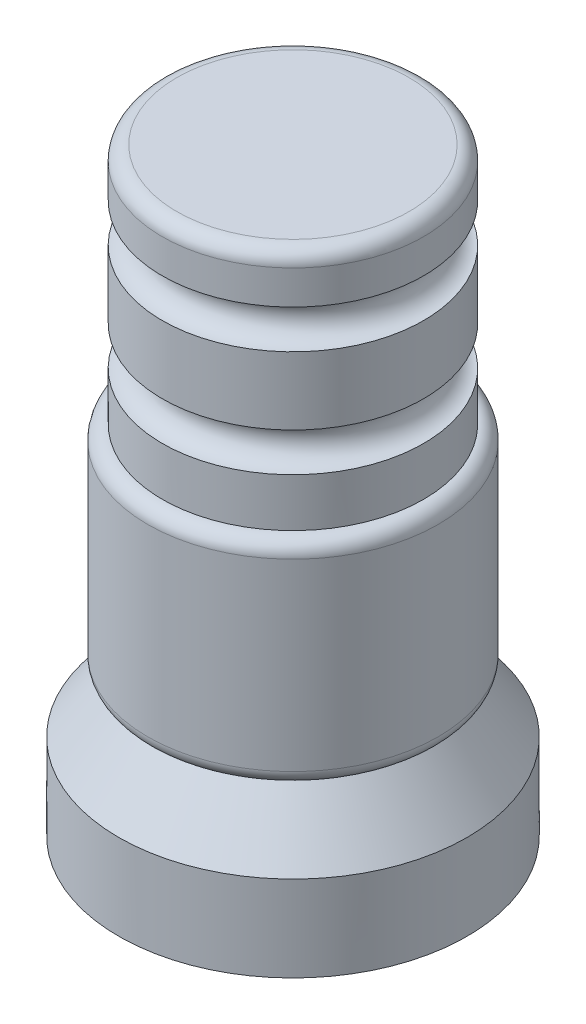
ISO-10303-21;
HEADER;
FILE_DESCRIPTION(('STEP AP214'),'2;1');
FILE_NAME('part.step','',(''),(''),'','','');
FILE_SCHEMA(('AUTOMOTIVE_DESIGN { 1 0 10303 214 1 1 1 1 }'));
ENDSEC;
DATA;
#1=APPLICATION_CONTEXT('core data for automotive mechanical design processes');
#2=APPLICATION_PROTOCOL_DEFINITION('international standard','automotive_design',2000,#1);
#3=PRODUCT_CONTEXT('',#1,'mechanical');
#4=PRODUCT('Part','Part','',(#3));
#5=PRODUCT_RELATED_PRODUCT_CATEGORY('part','',(#4));
#6=PRODUCT_DEFINITION_FORMATION('','',#4);
#7=PRODUCT_DEFINITION_CONTEXT('part definition',#1,'design');
#8=PRODUCT_DEFINITION('design','',#6,#7);
#9=PRODUCT_DEFINITION_SHAPE('','',#8);
#10=(LENGTH_UNIT() NAMED_UNIT(*) SI_UNIT(.MILLI.,.METRE.));
#11=(NAMED_UNIT(*) PLANE_ANGLE_UNIT() SI_UNIT($,.RADIAN.));
#12=(NAMED_UNIT(*) SI_UNIT($,.STERADIAN.) SOLID_ANGLE_UNIT());
#13=UNCERTAINTY_MEASURE_WITH_UNIT(LENGTH_MEASURE(1.E-05),#10,'distance_accuracy_value','');
#14=(GEOMETRIC_REPRESENTATION_CONTEXT(3) GLOBAL_UNCERTAINTY_ASSIGNED_CONTEXT((#13)) GLOBAL_UNIT_ASSIGNED_CONTEXT((#10,
#11,#12)) REPRESENTATION_CONTEXT('',''));
#15=CARTESIAN_POINT('',(0.,0.,0.));
#16=DIRECTION('',(0.,0.,1.));
#17=DIRECTION('',(1.,0.,0.));
#18=AXIS2_PLACEMENT_3D('',#15,#16,#17);
#19=CARTESIAN_POINT('',(-11.0661066677932,-10.1124479600333,0.));
#20=DIRECTION('',(0.,1.,0.));
#21=DIRECTION('',(-1.,0.,0.));
#22=AXIS2_PLACEMENT_3D('',#19,#20,#21);
#23=CYLINDRICAL_SURFACE('',#22,15.);
#24=CARTESIAN_POINT('',(-11.0661066677932,10.3875520399667,0.));
#25=DIRECTION('',(0.,-1.,0.));
#26=DIRECTION('',(1.,0.,0.));
#27=AXIS2_PLACEMENT_3D('',#24,#25,#26);
#28=CIRCLE('',#27,15.);
#29=CARTESIAN_POINT('',(3.93389333220679,10.3875520399667,0.));
#30=VERTEX_POINT('',#29);
#31=EDGE_CURVE('E44',#30,#30,#28,.T.);
#32=ORIENTED_EDGE('',*,*,#31,.T.);
#33=EDGE_LOOP('',(#32));
#34=FACE_BOUND('',#33,.T.);
#35=CARTESIAN_POINT('',(-11.0661066677932,-8.6124479600333,0.));
#36=DIRECTION('',(0.,-1.,0.));
#37=DIRECTION('',(1.,0.,0.));
#38=AXIS2_PLACEMENT_3D('',#35,#36,#37);
#39=CIRCLE('',#38,15.);
#40=CARTESIAN_POINT('',(3.93389333220679,-8.61244796003331,0.));
#41=VERTEX_POINT('',#40);
#42=EDGE_CURVE('E48',#41,#41,#39,.F.);
#43=ORIENTED_EDGE('',*,*,#42,.T.);
#44=EDGE_LOOP('',(#43));
#45=FACE_BOUND('',#44,.T.);
#46=ADVANCED_FACE('F37',(#34,#45),#23,.T.);
#47=CARTESIAN_POINT('',(-11.0661066677932,36.8875520399667,0.));
#48=DIRECTION('',(0.,1.,0.));
#49=DIRECTION('',(-1.,0.,0.));
#50=AXIS2_PLACEMENT_3D('',#47,#48,#49);
#51=CYLINDRICAL_SURFACE('',#50,13.5);
#52=CARTESIAN_POINT('',(-11.0661066677932,11.8875520399667,0.));
#53=DIRECTION('',(0.,-1.,0.));
#54=DIRECTION('',(1.,0.,0.));
#55=AXIS2_PLACEMENT_3D('',#52,#53,#54);
#56=CIRCLE('',#55,13.5);
#57=CARTESIAN_POINT('',(2.43389333220679,11.8875520399667,0.));
#58=VERTEX_POINT('',#57);
#59=EDGE_CURVE('E72',#58,#58,#56,.F.);
#60=ORIENTED_EDGE('',*,*,#59,.T.);
#61=EDGE_LOOP('',(#60));
#62=FACE_BOUND('',#61,.T.);
#63=CARTESIAN_POINT('',(-11.0661066677932,16.8875520399667,0.));
#64=DIRECTION('',(0.,1.,0.));
#65=DIRECTION('',(-1.,0.,0.));
#66=AXIS2_PLACEMENT_3D('',#63,#64,#65);
#67=CIRCLE('',#66,13.5);
#68=CARTESIAN_POINT('',(-24.5661066677932,16.8875520399667,0.));
#69=VERTEX_POINT('',#68);
#70=EDGE_CURVE('E57',#69,#69,#67,.T.);
#71=ORIENTED_EDGE('',*,*,#70,.F.);
#72=EDGE_LOOP('',(#71));
#73=FACE_BOUND('',#72,.T.);
#74=ADVANCED_FACE('F94',(#62,#73),#51,.T.);
#75=CARTESIAN_POINT('',(-11.0661066677932,18.8875520399667,0.));
#76=DIRECTION('',(0.,1.,0.));
#77=DIRECTION('',(-1.,0.,0.));
#78=AXIS2_PLACEMENT_3D('',#75,#76,#77);
#79=TOROIDAL_SURFACE('',#78,13.5,2.);
#80=ORIENTED_EDGE('',*,*,#70,.T.);
#81=EDGE_LOOP('',(#80));
#82=FACE_BOUND('',#81,.T.);
#83=CARTESIAN_POINT('',(-11.0661066677932,20.8875520399667,0.));
#84=DIRECTION('',(0.,1.,0.));
#85=DIRECTION('',(-1.,0.,0.));
#86=AXIS2_PLACEMENT_3D('',#83,#84,#85);
#87=CIRCLE('',#86,13.5);
#88=CARTESIAN_POINT('',(-24.5661066677932,20.8875520399667,0.));
#89=VERTEX_POINT('',#88);
#90=EDGE_CURVE('E60',#89,#89,#87,.T.);
#91=ORIENTED_EDGE('',*,*,#90,.F.);
#92=EDGE_LOOP('',(#91));
#93=FACE_BOUND('',#92,.T.);
#94=ADVANCED_FACE('F99',(#82,#93),#79,.F.);
#95=CARTESIAN_POINT('',(-11.0661066677932,36.8875520399667,0.));
#96=DIRECTION('',(0.,1.,0.));
#97=DIRECTION('',(-1.,0.,0.));
#98=AXIS2_PLACEMENT_3D('',#95,#96,#97);
#99=CYLINDRICAL_SURFACE('',#98,13.5);
#100=ORIENTED_EDGE('',*,*,#90,.T.);
#101=EDGE_LOOP('',(#100));
#102=FACE_BOUND('',#101,.T.);
#103=CARTESIAN_POINT('',(-11.0661066677932,27.8875520399667,0.));
#104=DIRECTION('',(0.,1.,0.));
#105=DIRECTION('',(-1.,0.,0.));
#106=AXIS2_PLACEMENT_3D('',#103,#104,#105);
#107=CIRCLE('',#106,13.5);
#108=CARTESIAN_POINT('',(-24.5661066677932,27.8875520399667,0.));
#109=VERTEX_POINT('',#108);
#110=EDGE_CURVE('E63',#109,#109,#107,.T.);
#111=ORIENTED_EDGE('',*,*,#110,.F.);
#112=EDGE_LOOP('',(#111));
#113=FACE_BOUND('',#112,.T.);
#114=ADVANCED_FACE('F118',(#102,#113),#99,.T.);
#115=CARTESIAN_POINT('',(-11.0661066677932,29.8875520399667,0.));
#116=DIRECTION('',(0.,1.,0.));
#117=DIRECTION('',(-1.,0.,0.));
#118=AXIS2_PLACEMENT_3D('',#115,#116,#117);
#119=TOROIDAL_SURFACE('',#118,13.5,2.);
#120=ORIENTED_EDGE('',*,*,#110,.T.);
#121=EDGE_LOOP('',(#120));
#122=FACE_BOUND('',#121,.T.);
#123=CARTESIAN_POINT('',(-11.0661066677932,31.8875520399667,0.));
#124=DIRECTION('',(0.,1.,0.));
#125=DIRECTION('',(-1.,0.,0.));
#126=AXIS2_PLACEMENT_3D('',#123,#124,#125);
#127=CIRCLE('',#126,13.5);
#128=CARTESIAN_POINT('',(-24.5661066677932,31.8875520399667,0.));
#129=VERTEX_POINT('',#128);
#130=EDGE_CURVE('E66',#129,#129,#127,.T.);
#131=ORIENTED_EDGE('',*,*,#130,.F.);
#132=EDGE_LOOP('',(#131));
#133=FACE_BOUND('',#132,.T.);
#134=ADVANCED_FACE('F114',(#122,#133),#119,.F.);
#135=CARTESIAN_POINT('',(-11.0661066677932,36.8875520399667,0.));
#136=DIRECTION('',(0.,1.,0.));
#137=DIRECTION('',(-1.,0.,0.));
#138=AXIS2_PLACEMENT_3D('',#135,#136,#137);
#139=CYLINDRICAL_SURFACE('',#138,13.5);
#140=CARTESIAN_POINT('',(-11.0661066677932,35.3875520399667,0.));
#141=DIRECTION('',(0.,1.,0.));
#142=DIRECTION('',(-1.,0.,0.));
#143=AXIS2_PLACEMENT_3D('',#140,#141,#142);
#144=CIRCLE('',#143,13.5);
#145=CARTESIAN_POINT('',(-24.5661066677932,35.3875520399667,0.));
#146=VERTEX_POINT('',#145);
#147=EDGE_CURVE('E52',#146,#146,#144,.F.);
#148=ORIENTED_EDGE('',*,*,#147,.T.);
#149=EDGE_LOOP('',(#148));
#150=FACE_BOUND('',#149,.T.);
#151=ORIENTED_EDGE('',*,*,#130,.T.);
#152=EDGE_LOOP('',(#151));
#153=FACE_BOUND('',#152,.T.);
#154=ADVANCED_FACE('F111',(#150,#153),#139,.T.);
#155=CARTESIAN_POINT('',(-11.0661066677932,35.3875520399667,0.));
#156=DIRECTION('',(0.,1.,0.));
#157=DIRECTION('',(-1.,0.,0.));
#158=AXIS2_PLACEMENT_3D('',#155,#156,#157);
#159=TOROIDAL_SURFACE('',#158,12.,1.5);
#160=ORIENTED_EDGE('',*,*,#147,.F.);
#161=EDGE_LOOP('',(#160));
#162=FACE_BOUND('',#161,.T.);
#163=CARTESIAN_POINT('',(-11.0661066677932,36.8875520399667,0.));
#164=DIRECTION('',(0.,1.,0.));
#165=DIRECTION('',(-1.,0.,0.));
#166=AXIS2_PLACEMENT_3D('',#163,#164,#165);
#167=CIRCLE('',#166,12.);
#168=CARTESIAN_POINT('',(-23.0661066677932,36.8875520399667,0.));
#169=VERTEX_POINT('',#168);
#170=EDGE_CURVE('E69',#169,#169,#167,.F.);
#171=ORIENTED_EDGE('',*,*,#170,.T.);
#172=EDGE_LOOP('',(#171));
#173=FACE_BOUND('',#172,.T.);
#174=ADVANCED_FACE('F109',(#162,#173),#159,.T.);
#175=CARTESIAN_POINT('',(-11.0661066677932,36.8875520399667,0.));
#176=DIRECTION('',(0.,1.,0.));
#177=DIRECTION('',(-1.,0.,0.));
#178=AXIS2_PLACEMENT_3D('',#175,#176,#177);
#179=PLANE('',#178);
#180=ORIENTED_EDGE('',*,*,#170,.F.);
#181=EDGE_LOOP('',(#180));
#182=FACE_BOUND('',#181,.T.);
#183=ADVANCED_FACE('F105',(#182),#179,.T.);
#184=CARTESIAN_POINT('',(-11.0661066677932,10.3875520399667,0.));
#185=DIRECTION('',(0.,-1.,0.));
#186=DIRECTION('',(1.,0.,0.));
#187=AXIS2_PLACEMENT_3D('',#184,#185,#186);
#188=TOROIDAL_SURFACE('',#187,13.5,1.5);
#189=ORIENTED_EDGE('',*,*,#59,.F.);
#190=EDGE_LOOP('',(#189));
#191=FACE_BOUND('',#190,.T.);
#192=ORIENTED_EDGE('',*,*,#31,.F.);
#193=EDGE_LOOP('',(#192));
#194=FACE_BOUND('',#193,.T.);
#195=ADVANCED_FACE('F108',(#191,#194),#188,.T.);
#196=CARTESIAN_POINT('',(-11.0661066677932,-8.6124479600333,0.));
#197=DIRECTION('',(0.,-1.,0.));
#198=DIRECTION('',(1.,0.,0.));
#199=AXIS2_PLACEMENT_3D('',#196,#197,#198);
#200=TOROIDAL_SURFACE('',#199,13.5,1.5);
#201=ORIENTED_EDGE('',*,*,#42,.F.);
#202=EDGE_LOOP('',(#201));
#203=FACE_BOUND('',#202,.T.);
#204=CARTESIAN_POINT('',(-11.0661066677932,-10.1124479600333,0.));
#205=DIRECTION('',(0.,-1.,0.));
#206=DIRECTION('',(1.,0.,0.));
#207=AXIS2_PLACEMENT_3D('',#204,#205,#206);
#208=CIRCLE('',#207,13.5);
#209=CARTESIAN_POINT('',(2.43389333220679,-10.1124479600333,0.));
#210=VERTEX_POINT('',#209);
#211=EDGE_CURVE('E10',#210,#210,#208,.T.);
#212=ORIENTED_EDGE('',*,*,#211,.F.);
#213=EDGE_LOOP('',(#212));
#214=FACE_BOUND('',#213,.T.);
#215=ADVANCED_FACE('F39',(#203,#214),#200,.T.);
#216=CARTESIAN_POINT('',(-11.0661066677932,-16.1124479600333,0.));
#217=DIRECTION('',(0.,-1.,0.));
#218=DIRECTION('',(1.,0.,0.));
#219=AXIS2_PLACEMENT_3D('',#216,#217,#218);
#220=CONICAL_SURFACE('',#219,18.,0.643501108793284);
#221=ORIENTED_EDGE('',*,*,#211,.T.);
#222=EDGE_LOOP('',(#221));
#223=FACE_BOUND('',#222,.T.);
#224=CARTESIAN_POINT('',(-11.0661066677932,-16.1124479600333,0.));
#225=DIRECTION('',(0.,1.,0.));
#226=DIRECTION('',(-1.,0.,0.));
#227=AXIS2_PLACEMENT_3D('',#224,#225,#226);
#228=CIRCLE('',#227,18.);
#229=CARTESIAN_POINT('',(-29.0661066677932,-16.1124479600333,0.));
#230=VERTEX_POINT('',#229);
#231=EDGE_CURVE('E75',#230,#230,#228,.T.);
#232=ORIENTED_EDGE('',*,*,#231,.T.);
#233=EDGE_LOOP('',(#232));
#234=FACE_BOUND('',#233,.T.);
#235=ADVANCED_FACE('F90',(#223,#234),#220,.T.);
#236=CARTESIAN_POINT('',(-11.0661066677932,-10.1124479600333,0.));
#237=DIRECTION('',(0.,1.,0.));
#238=DIRECTION('',(-1.,0.,0.));
#239=AXIS2_PLACEMENT_3D('',#236,#237,#238);
#240=CYLINDRICAL_SURFACE('',#239,18.);
#241=ORIENTED_EDGE('',*,*,#231,.F.);
#242=EDGE_LOOP('',(#241));
#243=FACE_BOUND('',#242,.T.);
#244=CARTESIAN_POINT('',(-11.0661066677932,-24.9622468404596,0.));
#245=DIRECTION('',(0.,1.,0.));
#246=DIRECTION('',(-1.,0.,0.));
#247=AXIS2_PLACEMENT_3D('',#244,#245,#246);
#248=CIRCLE('',#247,18.);
#249=CARTESIAN_POINT('',(-29.0661066677932,-24.9622468404596,0.));
#250=VERTEX_POINT('',#249);
#251=EDGE_CURVE('E78',#250,#250,#248,.T.);
#252=ORIENTED_EDGE('',*,*,#251,.T.);
#253=EDGE_LOOP('',(#252));
#254=FACE_BOUND('',#253,.T.);
#255=ADVANCED_FACE('F82',(#243,#254),#240,.T.);
#256=CARTESIAN_POINT('',(6.93389333220679,-24.9622468404596,0.));
#257=DIRECTION('',(0.,1.,0.));
#258=DIRECTION('',(-1.,0.,0.));
#259=AXIS2_PLACEMENT_3D('',#256,#257,#258);
#260=PLANE('',#259);
#261=ORIENTED_EDGE('',*,*,#251,.F.);
#262=EDGE_LOOP('',(#261));
#263=FACE_BOUND('',#262,.T.);
#264=ADVANCED_FACE('F84',(#263),#260,.F.);
#265=CLOSED_SHELL('',(#46,#74,#94,#114,#134,#154,#174,#183,#195,#215,#235,#255,#264));
#266=MANIFOLD_SOLID_BREP('B2',#265);
#267=ADVANCED_BREP_SHAPE_REPRESENTATION('',(#18,#266),#14);
#268=SHAPE_DEFINITION_REPRESENTATION(#9,#267);
ENDSEC;
END-ISO-10303-21;
